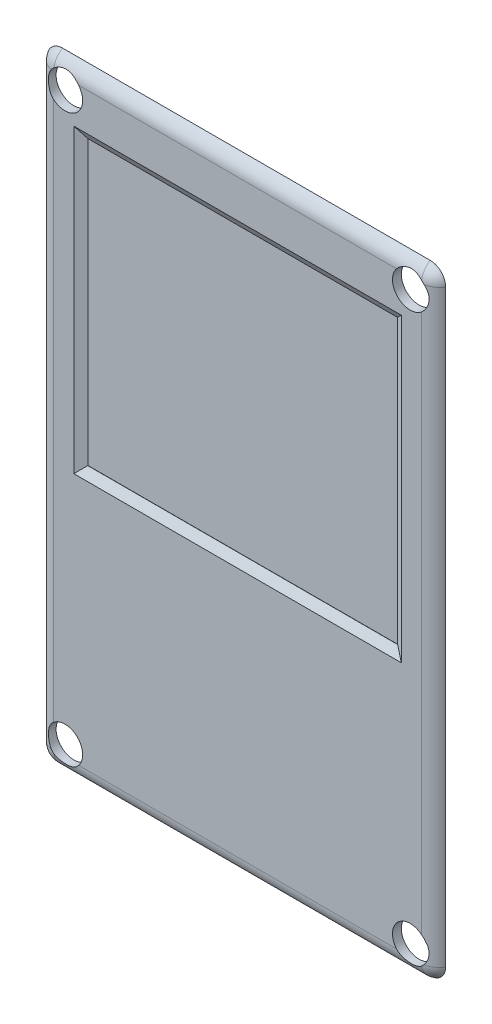
ISO-10303-21;
HEADER;
FILE_DESCRIPTION(('STEP AP214'),'2;1');
FILE_NAME('part.step','',(''),(''),'','','');
FILE_SCHEMA(('AUTOMOTIVE_DESIGN { 1 0 10303 214 1 1 1 1 }'));
ENDSEC;
DATA;
#1=APPLICATION_CONTEXT('core data for automotive mechanical design processes');
#2=APPLICATION_PROTOCOL_DEFINITION('international standard','automotive_design',2000,#1);
#3=PRODUCT_CONTEXT('',#1,'mechanical');
#4=PRODUCT('Part','Part','',(#3));
#5=PRODUCT_RELATED_PRODUCT_CATEGORY('part','',(#4));
#6=PRODUCT_DEFINITION_FORMATION('','',#4);
#7=PRODUCT_DEFINITION_CONTEXT('part definition',#1,'design');
#8=PRODUCT_DEFINITION('design','',#6,#7);
#9=PRODUCT_DEFINITION_SHAPE('','',#8);
#10=(LENGTH_UNIT() NAMED_UNIT(*) SI_UNIT(.MILLI.,.METRE.));
#11=(NAMED_UNIT(*) PLANE_ANGLE_UNIT() SI_UNIT($,.RADIAN.));
#12=(NAMED_UNIT(*) SI_UNIT($,.STERADIAN.) SOLID_ANGLE_UNIT());
#13=UNCERTAINTY_MEASURE_WITH_UNIT(LENGTH_MEASURE(1.E-05),#10,'distance_accuracy_value','');
#14=(GEOMETRIC_REPRESENTATION_CONTEXT(3) GLOBAL_UNCERTAINTY_ASSIGNED_CONTEXT((#13)) GLOBAL_UNIT_ASSIGNED_CONTEXT((#10,
#11,#12)) REPRESENTATION_CONTEXT('',''));
#15=CARTESIAN_POINT('',(0.,0.,0.));
#16=DIRECTION('',(0.,0.,1.));
#17=DIRECTION('',(1.,0.,0.));
#18=AXIS2_PLACEMENT_3D('',#15,#16,#17);
#19=CARTESIAN_POINT('',(0.,0.,1.));
#20=DIRECTION('',(0.,0.,-1.));
#21=DIRECTION('',(-1.,0.,0.));
#22=AXIS2_PLACEMENT_3D('',#19,#20,#21);
#23=PLANE('',#22);
#24=DIRECTION('',(0.,-1.,0.));
#25=VECTOR('',#24,1.);
#26=CARTESIAN_POINT('',(41.,0.,1.));
#27=LINE('',#26,#25);
#28=CARTESIAN_POINT('',(41.,64.,1.));
#29=VERTEX_POINT('',#28);
#30=CARTESIAN_POINT('',(41.,30.,1.));
#31=VERTEX_POINT('',#30);
#32=EDGE_CURVE('E531',#29,#31,#27,.T.);
#33=ORIENTED_EDGE('',*,*,#32,.T.);
#34=DIRECTION('',(-1.,0.,0.));
#35=VECTOR('',#34,1.);
#36=CARTESIAN_POINT('',(0.,30.,1.));
#37=LINE('',#36,#35);
#38=CARTESIAN_POINT('',(3.99999999999999,30.,1.));
#39=VERTEX_POINT('',#38);
#40=EDGE_CURVE('E534',#31,#39,#37,.T.);
#41=ORIENTED_EDGE('',*,*,#40,.T.);
#42=DIRECTION('',(0.,1.,0.));
#43=VECTOR('',#42,1.);
#44=CARTESIAN_POINT('',(3.99999999999999,0.,1.));
#45=LINE('',#44,#43);
#46=CARTESIAN_POINT('',(3.99999999999998,64.,1.));
#47=VERTEX_POINT('',#46);
#48=EDGE_CURVE('E523',#39,#47,#45,.T.);
#49=ORIENTED_EDGE('',*,*,#48,.T.);
#50=DIRECTION('',(1.,0.,0.));
#51=VECTOR('',#50,1.);
#52=CARTESIAN_POINT('',(0.,64.,1.));
#53=LINE('',#52,#51);
#54=EDGE_CURVE('E526',#47,#29,#53,.T.);
#55=ORIENTED_EDGE('',*,*,#54,.T.);
#56=EDGE_LOOP('',(#33,#41,#49,#55));
#57=FACE_BOUND('',#56,.T.);
#58=CARTESIAN_POINT('',(3.,3.,1.));
#59=DIRECTION('',(0.,0.,1.));
#60=DIRECTION('',(1.,0.,0.));
#61=AXIS2_PLACEMENT_3D('',#58,#59,#60);
#62=CIRCLE('',#61,2.);
#63=CARTESIAN_POINT('',(4.54670774402059,1.73205080756888,1.));
#64=VERTEX_POINT('',#63);
#65=CARTESIAN_POINT('',(1.73205080756888,4.54670774402059,1.));
#66=VERTEX_POINT('',#65);
#67=EDGE_CURVE('E233',#64,#66,#62,.T.);
#68=ORIENTED_EDGE('',*,*,#67,.F.);
#69=DIRECTION('',(-1.,0.,0.));
#70=VECTOR('',#69,1.);
#71=CARTESIAN_POINT('',(0.,1.73205080756888,1.));
#72=LINE('',#71,#70);
#73=CARTESIAN_POINT('',(40.4532922559794,1.73205080756888,1.));
#74=VERTEX_POINT('',#73);
#75=EDGE_CURVE('E264',#64,#74,#72,.F.);
#76=ORIENTED_EDGE('',*,*,#75,.T.);
#77=CARTESIAN_POINT('',(42.,3.,1.));
#78=DIRECTION('',(0.,0.,1.));
#79=DIRECTION('',(1.,0.,0.));
#80=AXIS2_PLACEMENT_3D('',#77,#78,#79);
#81=CIRCLE('',#80,2.);
#82=CARTESIAN_POINT('',(43.2679491924311,4.5467077440206,1.));
#83=VERTEX_POINT('',#82);
#84=EDGE_CURVE('E225',#83,#74,#81,.T.);
#85=ORIENTED_EDGE('',*,*,#84,.F.);
#86=DIRECTION('',(0.,-1.,0.));
#87=VECTOR('',#86,1.);
#88=CARTESIAN_POINT('',(43.2679491924311,0.,1.));
#89=LINE('',#88,#87);
#90=CARTESIAN_POINT('',(43.2679491924311,65.4532922559794,1.));
#91=VERTEX_POINT('',#90);
#92=EDGE_CURVE('E255',#83,#91,#89,.F.);
#93=ORIENTED_EDGE('',*,*,#92,.T.);
#94=CARTESIAN_POINT('',(42.,67.,1.));
#95=DIRECTION('',(0.,0.,1.));
#96=DIRECTION('',(1.,0.,0.));
#97=AXIS2_PLACEMENT_3D('',#94,#95,#96);
#98=CIRCLE('',#97,2.);
#99=CARTESIAN_POINT('',(40.4532922559794,68.2679491924311,1.));
#100=VERTEX_POINT('',#99);
#101=EDGE_CURVE('E217',#100,#91,#98,.T.);
#102=ORIENTED_EDGE('',*,*,#101,.F.);
#103=DIRECTION('',(1.,0.,0.));
#104=VECTOR('',#103,1.);
#105=CARTESIAN_POINT('',(0.,68.2679491924311,1.));
#106=LINE('',#105,#104);
#107=CARTESIAN_POINT('',(4.54670774402059,68.2679491924311,1.));
#108=VERTEX_POINT('',#107);
#109=EDGE_CURVE('E258',#100,#108,#106,.F.);
#110=ORIENTED_EDGE('',*,*,#109,.T.);
#111=CARTESIAN_POINT('',(3.,67.,1.));
#112=DIRECTION('',(0.,0.,1.));
#113=DIRECTION('',(1.,0.,0.));
#114=AXIS2_PLACEMENT_3D('',#111,#112,#113);
#115=CIRCLE('',#114,2.);
#116=CARTESIAN_POINT('',(1.73205080756888,65.4532922559794,1.));
#117=VERTEX_POINT('',#116);
#118=EDGE_CURVE('E209',#117,#108,#115,.T.);
#119=ORIENTED_EDGE('',*,*,#118,.F.);
#120=DIRECTION('',(0.,1.,0.));
#121=VECTOR('',#120,1.);
#122=CARTESIAN_POINT('',(1.73205080756888,0.,1.));
#123=LINE('',#122,#121);
#124=EDGE_CURVE('E261',#117,#66,#123,.F.);
#125=ORIENTED_EDGE('',*,*,#124,.T.);
#126=EDGE_LOOP('',(#68,#76,#85,#93,#102,#110,#119,#125));
#127=FACE_BOUND('',#126,.T.);
#128=ADVANCED_FACE('F38',(#57,#127),#23,.F.);
#129=CARTESIAN_POINT('',(0.,0.,0.));
#130=DIRECTION('',(0.,0.,-1.));
#131=DIRECTION('',(-1.,0.,0.));
#132=AXIS2_PLACEMENT_3D('',#129,#130,#131);
#133=PLANE('',#132);
#134=CARTESIAN_POINT('',(42.,67.,0.));
#135=DIRECTION('',(0.,0.,1.));
#136=DIRECTION('',(1.,0.,0.));
#137=AXIS2_PLACEMENT_3D('',#134,#135,#136);
#138=CIRCLE('',#137,2.);
#139=CARTESIAN_POINT('',(44.,67.,0.));
#140=VERTEX_POINT('',#139);
#141=EDGE_CURVE('E213',#140,#140,#138,.T.);
#142=ORIENTED_EDGE('',*,*,#141,.T.);
#143=EDGE_LOOP('',(#142));
#144=FACE_BOUND('',#143,.T.);
#145=CARTESIAN_POINT('',(3.,3.,0.));
#146=DIRECTION('',(0.,0.,1.));
#147=DIRECTION('',(1.,0.,0.));
#148=AXIS2_PLACEMENT_3D('',#145,#146,#147);
#149=CIRCLE('',#148,2.);
#150=CARTESIAN_POINT('',(5.,3.,0.));
#151=VERTEX_POINT('',#150);
#152=EDGE_CURVE('E229',#151,#151,#149,.T.);
#153=ORIENTED_EDGE('',*,*,#152,.T.);
#154=EDGE_LOOP('',(#153));
#155=FACE_BOUND('',#154,.T.);
#156=DIRECTION('',(1.,0.,0.));
#157=VECTOR('',#156,1.);
#158=CARTESIAN_POINT('',(0.,0.,0.));
#159=LINE('',#158,#157);
#160=CARTESIAN_POINT('',(1.73205080756888,0.,0.));
#161=VERTEX_POINT('',#160);
#162=CARTESIAN_POINT('',(43.2679491924311,0.,0.));
#163=VERTEX_POINT('',#162);
#164=EDGE_CURVE('E244',#161,#163,#159,.T.);
#165=ORIENTED_EDGE('',*,*,#164,.F.);
#166=CARTESIAN_POINT('',(1.73205080756888,1.73205080756888,0.));
#167=DIRECTION('',(0.,0.,-1.));
#168=DIRECTION('',(-1.,0.,0.));
#169=AXIS2_PLACEMENT_3D('',#166,#167,#168);
#170=CIRCLE('',#169,1.73205080756888);
#171=CARTESIAN_POINT('',(0.,1.73205080756888,0.));
#172=VERTEX_POINT('',#171);
#173=EDGE_CURVE('E443',#161,#172,#170,.T.);
#174=ORIENTED_EDGE('',*,*,#173,.T.);
#175=DIRECTION('',(0.,-1.,0.));
#176=VECTOR('',#175,1.);
#177=CARTESIAN_POINT('',(0.,0.,0.));
#178=LINE('',#177,#176);
#179=CARTESIAN_POINT('',(0.,68.2679491924311,0.));
#180=VERTEX_POINT('',#179);
#181=EDGE_CURVE('E237',#180,#172,#178,.T.);
#182=ORIENTED_EDGE('',*,*,#181,.F.);
#183=CARTESIAN_POINT('',(1.73205080756888,68.2679491924311,0.));
#184=DIRECTION('',(0.,0.,-1.));
#185=DIRECTION('',(-1.,0.,0.));
#186=AXIS2_PLACEMENT_3D('',#183,#184,#185);
#187=CIRCLE('',#186,1.73205080756888);
#188=CARTESIAN_POINT('',(1.73205080756888,70.,0.));
#189=VERTEX_POINT('',#188);
#190=EDGE_CURVE('E506',#180,#189,#187,.T.);
#191=ORIENTED_EDGE('',*,*,#190,.T.);
#192=DIRECTION('',(-1.,0.,0.));
#193=VECTOR('',#192,1.);
#194=CARTESIAN_POINT('',(0.,70.,0.));
#195=LINE('',#194,#193);
#196=CARTESIAN_POINT('',(43.2679491924311,70.,0.));
#197=VERTEX_POINT('',#196);
#198=EDGE_CURVE('E252',#197,#189,#195,.T.);
#199=ORIENTED_EDGE('',*,*,#198,.F.);
#200=CARTESIAN_POINT('',(43.2679491924311,68.2679491924311,0.));
#201=DIRECTION('',(0.,0.,-1.));
#202=DIRECTION('',(-1.,0.,0.));
#203=AXIS2_PLACEMENT_3D('',#200,#201,#202);
#204=CIRCLE('',#203,1.73205080756888);
#205=CARTESIAN_POINT('',(45.,68.2679491924311,0.));
#206=VERTEX_POINT('',#205);
#207=EDGE_CURVE('E437',#197,#206,#204,.T.);
#208=ORIENTED_EDGE('',*,*,#207,.T.);
#209=DIRECTION('',(0.,1.,0.));
#210=VECTOR('',#209,1.);
#211=CARTESIAN_POINT('',(45.,0.,0.));
#212=LINE('',#211,#210);
#213=CARTESIAN_POINT('',(45.,1.73205080756888,0.));
#214=VERTEX_POINT('',#213);
#215=EDGE_CURVE('E248',#214,#206,#212,.T.);
#216=ORIENTED_EDGE('',*,*,#215,.F.);
#217=CARTESIAN_POINT('',(43.2679491924311,1.73205080756888,0.));
#218=DIRECTION('',(0.,0.,-1.));
#219=DIRECTION('',(-1.,0.,0.));
#220=AXIS2_PLACEMENT_3D('',#217,#218,#219);
#221=CIRCLE('',#220,1.73205080756888);
#222=EDGE_CURVE('E440',#214,#163,#221,.T.);
#223=ORIENTED_EDGE('',*,*,#222,.T.);
#224=EDGE_LOOP('',(#165,#174,#182,#191,#199,#208,#216,#223));
#225=FACE_BOUND('',#224,.T.);
#226=CARTESIAN_POINT('',(42.,3.,0.));
#227=DIRECTION('',(0.,0.,1.));
#228=DIRECTION('',(1.,0.,0.));
#229=AXIS2_PLACEMENT_3D('',#226,#227,#228);
#230=CIRCLE('',#229,2.);
#231=CARTESIAN_POINT('',(44.,3.,0.));
#232=VERTEX_POINT('',#231);
#233=EDGE_CURVE('E221',#232,#232,#230,.T.);
#234=ORIENTED_EDGE('',*,*,#233,.T.);
#235=EDGE_LOOP('',(#234));
#236=FACE_BOUND('',#235,.T.);
#237=CARTESIAN_POINT('',(3.,67.,0.));
#238=DIRECTION('',(0.,0.,1.));
#239=DIRECTION('',(1.,0.,0.));
#240=AXIS2_PLACEMENT_3D('',#237,#238,#239);
#241=CIRCLE('',#240,2.);
#242=CARTESIAN_POINT('',(5.,67.,0.));
#243=VERTEX_POINT('',#242);
#244=EDGE_CURVE('E203',#243,#243,#241,.T.);
#245=ORIENTED_EDGE('',*,*,#244,.T.);
#246=EDGE_LOOP('',(#245));
#247=FACE_BOUND('',#246,.T.);
#248=ADVANCED_FACE('F370',(#144,#155,#225,#236,#247),#133,.T.);
#249=CARTESIAN_POINT('',(3.,3.,1.));
#250=DIRECTION('',(0.,0.,-1.));
#251=DIRECTION('',(-1.,0.,0.));
#252=AXIS2_PLACEMENT_3D('',#249,#250,#251);
#253=CYLINDRICAL_SURFACE('',#252,2.);
#254=CARTESIAN_POINT('',(1.73205080756888,4.54670774402059,1.));
#255=CARTESIAN_POINT('',(1.68942090742648,4.51176501398997,0.99999994952929));
#256=CARTESIAN_POINT('',(1.64827955739233,4.47508684268151,0.998637351965732));
#257=CARTESIAN_POINT('',(1.56925683016252,4.39856871271128,0.993756114654367));
#258=CARTESIAN_POINT('',(1.53137248495384,4.35873169765017,0.990239462099776));
#259=CARTESIAN_POINT('',(1.42309253267321,4.23504683389057,0.977327109578218));
#260=CARTESIAN_POINT('',(1.35785797276758,4.14685056381454,0.965563417623844));
#261=CARTESIAN_POINT('',(1.24291285980056,3.96152346106263,0.940158015800067));
#262=CARTESIAN_POINT('',(1.19316416453257,3.86441535560524,0.926521041357541));
#263=CARTESIAN_POINT('',(1.10999943956261,3.66313191366588,0.901301177702394));
#264=CARTESIAN_POINT('',(1.07658554196436,3.55895565663139,0.889718556760454));
#265=CARTESIAN_POINT('',(1.02633374124687,3.34258403755406,0.871555789387361));
#266=CARTESIAN_POINT('',(1.01007205655011,3.23023794549001,0.86515113449693));
#267=CARTESIAN_POINT('',(0.996809596749699,3.00429539104492,0.85996765158949));
#268=CARTESIAN_POINT('',(0.999795040508532,2.89069988142584,0.861183367293215));
#269=CARTESIAN_POINT('',(1.02400942586525,2.67349712188182,0.87051166867929));
#270=CARTESIAN_POINT('',(1.04400915503521,2.56972877686385,0.878159169435495));
#271=CARTESIAN_POINT('',(1.09991864939778,2.36692401757929,0.897703790653173));
#272=CARTESIAN_POINT('',(1.13584745671772,2.2678934244253,0.909605994013024));
#273=CARTESIAN_POINT('',(1.22870909902796,2.06364863875985,0.936305671339136));
#274=CARTESIAN_POINT('',(1.28784302529463,1.9594420378841,0.951276473734035));
#275=CARTESIAN_POINT('',(1.38986004665449,1.81213185110468,0.970812431575449));
#276=CARTESIAN_POINT('',(1.42610285787408,1.76451054210445,0.976839601412846));
#277=CARTESIAN_POINT('',(1.50282428887054,1.67257870500859,0.987197266390099));
#278=CARTESIAN_POINT('',(1.54330494581549,1.62826978691197,0.991526940740406));
#279=CARTESIAN_POINT('',(1.5857864376269,1.5857864376269,0.994644513211687));
#280=B_SPLINE_CURVE_WITH_KNOTS('',3,(#254,#255,#256,#257,#258,#259,#260,#261,#262,#263,#264,
#265,#266,#267,#268,#269,#270,#271,#272,#273,#274,#275,#276,#277,#278,#279),.UNSPECIFIED.,.F.,
.F.,(4,2,2,2,2,2,2,2,2,2,2,2,4),(0.,0.165212127740173,0.330272070422933,0.659579373309191,
0.988069043263213,1.31660157797707,1.65585005475403,1.99485565320083,2.31126614131278,
2.62805590079043,2.98818591899734,3.16840034679873,3.34870180648225),.UNSPECIFIED.);
#281=CARTESIAN_POINT('',(1.45329225597941,1.73205080756888,0.980478141741469));
#282=VERTEX_POINT('',#281);
#283=EDGE_CURVE('E386',#66,#282,#280,.T.);
#284=ORIENTED_EDGE('',*,*,#283,.T.);
#285=CARTESIAN_POINT('',(1.45329225597941,1.73205080756888,0.980478141741469));
#286=CARTESIAN_POINT('',(1.49516195181283,1.68100098620581,0.986342452939327));
#287=CARTESIAN_POINT('',(1.53932667902866,1.63224619622515,0.989274608538257));
#288=CARTESIAN_POINT('',(1.63224619622515,1.53932667902866,0.989274608538257));
#289=CARTESIAN_POINT('',(1.68100098620581,1.49516195181283,0.986342452939328));
#290=CARTESIAN_POINT('',(1.73205080756888,1.45329225597941,0.980478141741469));
#291=B_SPLINE_CURVE_WITH_KNOTS('',3,(#285,#286,#287,#288,#289,#290),.UNSPECIFIED.,.F.,.F.,(4,2,
4),(0.,0.197548353354486,0.395096706708971),.UNSPECIFIED.);
#292=CARTESIAN_POINT('',(1.73205080756888,1.45329225597941,0.980478141741469));
#293=VERTEX_POINT('',#292);
#294=EDGE_CURVE('E448',#282,#293,#291,.T.);
#295=ORIENTED_EDGE('',*,*,#294,.T.);
#296=CARTESIAN_POINT('',(1.5857864376269,1.5857864376269,0.994644513211685));
#297=CARTESIAN_POINT('',(1.62547790093061,1.54609521000282,0.991732114062964));
#298=CARTESIAN_POINT('',(1.66676888227213,1.5081469392458,0.987760648980565));
#299=CARTESIAN_POINT('',(1.7522623619633,1.43594071238718,0.978293495590112));
#300=CARTESIAN_POINT('',(1.79646325547829,1.40168074918575,0.972798642158532));
#301=CARTESIAN_POINT('',(1.9331026581126,1.30465253951394,0.954907343353973));
#302=CARTESIAN_POINT('',(2.02954723121612,1.24766650896851,0.941107280589293));
#303=CARTESIAN_POINT('',(2.23054449822809,1.15056736922675,0.914268959196729));
#304=CARTESIAN_POINT('',(2.33509156877025,1.11044267980462,0.901230183040374));
#305=CARTESIAN_POINT('',(2.5497763489647,1.04814084773677,0.879725051697459));
#306=CARTESIAN_POINT('',(2.65990663248714,1.02594049705345,0.871252788633561));
#307=CARTESIAN_POINT('',(2.88114449692771,1.00047567891466,0.861448691684427));
#308=CARTESIAN_POINT('',(2.99221810171246,0.996956338547368,0.860020768031279));
#309=CARTESIAN_POINT('',(3.21329671443733,1.00832669230901,0.864472262637201));
#310=CARTESIAN_POINT('',(3.32330134213203,1.02322271158814,0.870354191625569));
#311=CARTESIAN_POINT('',(3.53371767710658,1.06966260178721,0.887273960773298));
#312=CARTESIAN_POINT('',(3.63433658802757,1.10037676865242,0.898051940207506));
#313=CARTESIAN_POINT('',(3.82927857343943,1.17701249896315,0.921858243254639));
#314=CARTESIAN_POINT('',(3.92360085153713,1.22293598170876,0.934886850780407));
#315=CARTESIAN_POINT('',(4.11463818683418,1.33530231731338,0.961194415055279));
#316=CARTESIAN_POINT('',(4.21035368078922,1.40351146666493,0.974325972163911));
#317=CARTESIAN_POINT('',(4.34420653824554,1.51791435091081,0.988876128459159));
#318=CARTESIAN_POINT('',(4.38726662198028,1.55813937245688,0.992870617265208));
#319=CARTESIAN_POINT('',(4.46978599965384,1.64235168439409,0.99843361559077));
#320=CARTESIAN_POINT('',(4.50924173652149,1.68634261012405,0.999999752438308));
#321=CARTESIAN_POINT('',(4.54670774402059,1.73205080756888,1.));
#322=B_SPLINE_CURVE_WITH_KNOTS('',3,(#296,#297,#298,#299,#300,#301,#302,#303,#304,#305,#306,
#307,#308,#309,#310,#311,#312,#313,#314,#315,#316,#317,#318,#319,#320,#321),.UNSPECIFIED.,.F.,
.F.,(4,2,2,2,2,2,2,2,2,2,2,2,4),(0.,0.168482724473795,0.336873295723139,0.673782866276044,
1.01046067052941,1.34670184956735,1.67834353076247,2.01009915305919,2.32599866069285,
2.64193804764297,2.99465461936718,3.17159360464045,3.34870536314445),.UNSPECIFIED.);
#323=EDGE_CURVE('E393',#293,#64,#322,.T.);
#324=ORIENTED_EDGE('',*,*,#323,.T.);
#325=ORIENTED_EDGE('',*,*,#67,.T.);
#326=EDGE_LOOP('',(#284,#295,#324,#325));
#327=FACE_BOUND('',#326,.T.);
#328=ORIENTED_EDGE('',*,*,#152,.F.);
#329=EDGE_LOOP('',(#328));
#330=FACE_BOUND('',#329,.T.);
#331=ADVANCED_FACE('F378',(#327,#330),#253,.F.);
#332=CARTESIAN_POINT('',(42.,3.,1.));
#333=DIRECTION('',(0.,0.,-1.));
#334=DIRECTION('',(-1.,0.,0.));
#335=AXIS2_PLACEMENT_3D('',#332,#333,#334);
#336=CYLINDRICAL_SURFACE('',#335,2.);
#337=CARTESIAN_POINT('',(40.4532922559794,1.73205080756888,1.));
#338=CARTESIAN_POINT('',(40.48823498601,1.68942090742648,0.999999949529289));
#339=CARTESIAN_POINT('',(40.5249131573185,1.64827955739233,0.998637351965732));
#340=CARTESIAN_POINT('',(40.6014312872887,1.56925683016252,0.993756114654367));
#341=CARTESIAN_POINT('',(40.6412683023498,1.53137248495384,0.990239462099776));
#342=CARTESIAN_POINT('',(40.7649531661094,1.42309253267321,0.977327109578219));
#343=CARTESIAN_POINT('',(40.8531494361855,1.35785797276758,0.965563417623844));
#344=CARTESIAN_POINT('',(41.0384765389374,1.24291285980056,0.940158015800066));
#345=CARTESIAN_POINT('',(41.1355846443948,1.19316416453257,0.926521041357541));
#346=CARTESIAN_POINT('',(41.3368680863341,1.1099994395626,0.901301177702394));
#347=CARTESIAN_POINT('',(41.4410443433686,1.07658554196436,0.889718556760453));
#348=CARTESIAN_POINT('',(41.6574159624459,1.02633374124687,0.87155578938736));
#349=CARTESIAN_POINT('',(41.76976205451,1.0100720565501,0.865151134496928));
#350=CARTESIAN_POINT('',(41.9957046089551,0.996809596749696,0.859967651589488));
#351=CARTESIAN_POINT('',(42.1093001185742,0.999795040508528,0.861183367293213));
#352=CARTESIAN_POINT('',(42.3265028781182,1.02400942586525,0.870511668679288));
#353=CARTESIAN_POINT('',(42.4302712231361,1.04400915503521,0.878159169435493));
#354=CARTESIAN_POINT('',(42.6330759824207,1.09991864939778,0.897703790653171));
#355=CARTESIAN_POINT('',(42.7321065755747,1.13584745671771,0.909605994013023));
#356=CARTESIAN_POINT('',(42.9363513612401,1.22870909902795,0.936305671339134));
#357=CARTESIAN_POINT('',(43.0405579621159,1.28784302529463,0.951276473734033));
#358=CARTESIAN_POINT('',(43.1878681488953,1.38986004665448,0.970812431575447));
#359=CARTESIAN_POINT('',(43.2354894578955,1.42610285787407,0.976839601412845));
#360=CARTESIAN_POINT('',(43.3274212949914,1.50282428887053,0.987197266390098));
#361=CARTESIAN_POINT('',(43.371730213088,1.54330494581548,0.991526940740405));
#362=CARTESIAN_POINT('',(43.4142135623731,1.5857864376269,0.994644513211686));
#363=B_SPLINE_CURVE_WITH_KNOTS('',3,(#337,#338,#339,#340,#341,#342,#343,#344,#345,#346,#347,
#348,#349,#350,#351,#352,#353,#354,#355,#356,#357,#358,#359,#360,#361,#362),.UNSPECIFIED.,.F.,
.F.,(4,2,2,2,2,2,2,2,2,2,2,2,4),(0.,0.165212127740179,0.330272070422937,0.659579373309193,
0.988069043263215,1.31660157797707,1.65585005475403,1.99485565320083,2.31126614131278,
2.62805590079043,2.98818591899734,3.16840034679872,3.34870180648225),.UNSPECIFIED.);
#364=CARTESIAN_POINT('',(43.2679491924311,1.4532922559794,0.980478141741468));
#365=VERTEX_POINT('',#364);
#366=EDGE_CURVE('E277',#74,#365,#363,.T.);
#367=ORIENTED_EDGE('',*,*,#366,.T.);
#368=CARTESIAN_POINT('',(43.2679491924311,1.4532922559794,0.980478141741468));
#369=CARTESIAN_POINT('',(43.3189990137942,1.49516195181282,0.986342452939327));
#370=CARTESIAN_POINT('',(43.3677538037748,1.53932667902865,0.989274608538256));
#371=CARTESIAN_POINT('',(43.4606733209713,1.63224619622514,0.989274608538257));
#372=CARTESIAN_POINT('',(43.5048380481872,1.6810009862058,0.986342452939327));
#373=CARTESIAN_POINT('',(43.5467077440206,1.73205080756888,0.980478141741468));
#374=B_SPLINE_CURVE_WITH_KNOTS('',3,(#368,#369,#370,#371,#372,#373),.UNSPECIFIED.,.F.,.F.,(4,2,
4),(0.,0.197548353354486,0.395096706708985),.UNSPECIFIED.);
#375=CARTESIAN_POINT('',(43.5467077440206,1.73205080756888,0.980478141741467));
#376=VERTEX_POINT('',#375);
#377=EDGE_CURVE('E455',#365,#376,#374,.T.);
#378=ORIENTED_EDGE('',*,*,#377,.T.);
#379=CARTESIAN_POINT('',(43.4142135623731,1.5857864376269,0.994644513211685));
#380=CARTESIAN_POINT('',(43.4539047899972,1.62547790093061,0.991732114062964));
#381=CARTESIAN_POINT('',(43.4918530607542,1.66676888227213,0.987760648980566));
#382=CARTESIAN_POINT('',(43.5640592876128,1.75226236196329,0.978293495590112));
#383=CARTESIAN_POINT('',(43.5983192508142,1.79646325547828,0.972798642158531));
#384=CARTESIAN_POINT('',(43.6953474604861,1.9331026581126,0.954907343353971));
#385=CARTESIAN_POINT('',(43.7523334910315,2.02954723121611,0.941107280589291));
#386=CARTESIAN_POINT('',(43.8494326307732,2.23054449822808,0.914268959196726));
#387=CARTESIAN_POINT('',(43.8895573201954,2.33509156877025,0.901230183040371));
#388=CARTESIAN_POINT('',(43.9518591522632,2.5497763489647,0.879725051697457));
#389=CARTESIAN_POINT('',(43.9740595029466,2.65990663248713,0.871252788633558));
#390=CARTESIAN_POINT('',(43.9995243210853,2.8811444969277,0.861448691684425));
#391=CARTESIAN_POINT('',(44.0030436614526,2.99221810171246,0.860020768031276));
#392=CARTESIAN_POINT('',(43.991673307691,3.21329671443733,0.864472262637197));
#393=CARTESIAN_POINT('',(43.9767772884119,3.32330134213202,0.870354191625566));
#394=CARTESIAN_POINT('',(43.9303373982128,3.53371767710657,0.887273960773295));
#395=CARTESIAN_POINT('',(43.8996232313476,3.63433658802757,0.898051940207503));
#396=CARTESIAN_POINT('',(43.8229875010369,3.82927857343942,0.921858243254635));
#397=CARTESIAN_POINT('',(43.7770640182912,3.92360085153713,0.934886850780403));
#398=CARTESIAN_POINT('',(43.6646976826866,4.11463818683418,0.961194415055277));
#399=CARTESIAN_POINT('',(43.5964885333351,4.21035368078922,0.97432597216391));
#400=CARTESIAN_POINT('',(43.4820856490892,4.34420653824555,0.988876128459159));
#401=CARTESIAN_POINT('',(43.4418606275431,4.38726662198029,0.992870617265208));
#402=CARTESIAN_POINT('',(43.3576483156059,4.46978599965384,0.99843361559077));
#403=CARTESIAN_POINT('',(43.3136573898759,4.50924173652149,0.999999752438309));
#404=CARTESIAN_POINT('',(43.2679491924311,4.5467077440206,1.));
#405=B_SPLINE_CURVE_WITH_KNOTS('',3,(#379,#380,#381,#382,#383,#384,#385,#386,#387,#388,#389,
#390,#391,#392,#393,#394,#395,#396,#397,#398,#399,#400,#401,#402,#403,#404),.UNSPECIFIED.,.F.,
.F.,(4,2,2,2,2,2,2,2,2,2,2,2,4),(0.,0.168482724473791,0.336873295723138,0.673782866276042,
1.0104606705294,1.34670184956735,1.67834353076246,2.01009915305919,2.32599866069285,
2.64193804764297,2.99465461936719,3.17159360464046,3.34870536314447),.UNSPECIFIED.);
#406=EDGE_CURVE('E268',#376,#83,#405,.T.);
#407=ORIENTED_EDGE('',*,*,#406,.T.);
#408=ORIENTED_EDGE('',*,*,#84,.T.);
#409=EDGE_LOOP('',(#367,#378,#407,#408));
#410=FACE_BOUND('',#409,.T.);
#411=ORIENTED_EDGE('',*,*,#233,.F.);
#412=EDGE_LOOP('',(#411));
#413=FACE_BOUND('',#412,.T.);
#414=ADVANCED_FACE('F284',(#410,#413),#336,.F.);
#415=CARTESIAN_POINT('',(42.,67.,1.));
#416=DIRECTION('',(0.,0.,-1.));
#417=DIRECTION('',(-1.,0.,0.));
#418=AXIS2_PLACEMENT_3D('',#415,#416,#417);
#419=CYLINDRICAL_SURFACE('',#418,2.);
#420=CARTESIAN_POINT('',(43.2679491924311,65.4532922559794,1.));
#421=CARTESIAN_POINT('',(43.3105790925735,65.48823498601,0.99999994952929));
#422=CARTESIAN_POINT('',(43.3517204426077,65.5249131573185,0.998637351965732));
#423=CARTESIAN_POINT('',(43.4307431698375,65.6014312872887,0.993756114654367));
#424=CARTESIAN_POINT('',(43.4686275150462,65.6412683023498,0.990239462099776));
#425=CARTESIAN_POINT('',(43.5769074673268,65.7649531661094,0.977327109578218));
#426=CARTESIAN_POINT('',(43.6421420272324,65.8531494361855,0.965563417623843));
#427=CARTESIAN_POINT('',(43.7570871401994,66.0384765389374,0.940158015800065));
#428=CARTESIAN_POINT('',(43.8068358354674,66.1355846443948,0.926521041357538));
#429=CARTESIAN_POINT('',(43.8900005604374,66.3368680863341,0.90130117770239));
#430=CARTESIAN_POINT('',(43.9234144580356,66.4410443433686,0.88971855676045));
#431=CARTESIAN_POINT('',(43.9736662587531,66.6574159624459,0.871555789387357));
#432=CARTESIAN_POINT('',(43.9899279434499,66.76976205451,0.865151134496926));
#433=CARTESIAN_POINT('',(44.0031904032503,66.9957046089551,0.859967651589487));
#434=CARTESIAN_POINT('',(44.0002049594915,67.1093001185742,0.861183367293211));
#435=CARTESIAN_POINT('',(43.9759905741348,67.3265028781182,0.870511668679287));
#436=CARTESIAN_POINT('',(43.9559908449648,67.4302712231361,0.878159169435492));
#437=CARTESIAN_POINT('',(43.9000813506022,67.6330759824207,0.89770379065317));
#438=CARTESIAN_POINT('',(43.8641525432823,67.7321065755747,0.909605994013022));
#439=CARTESIAN_POINT('',(43.7712909009721,67.9363513612402,0.936305671339133));
#440=CARTESIAN_POINT('',(43.7121569747054,68.0405579621159,0.951276473734032));
#441=CARTESIAN_POINT('',(43.6101399533455,68.1878681488953,0.970812431575447));
#442=CARTESIAN_POINT('',(43.5738971421259,68.2354894578956,0.976839601412845));
#443=CARTESIAN_POINT('',(43.4971757111295,68.3274212949914,0.987197266390098));
#444=CARTESIAN_POINT('',(43.4566950541845,68.371730213088,0.991526940740405));
#445=CARTESIAN_POINT('',(43.4142135623731,68.4142135623731,0.994644513211685));
#446=B_SPLINE_CURVE_WITH_KNOTS('',3,(#420,#421,#422,#423,#424,#425,#426,#427,#428,#429,#430,
#431,#432,#433,#434,#435,#436,#437,#438,#439,#440,#441,#442,#443,#444,#445),.UNSPECIFIED.,.F.,
.F.,(4,2,2,2,2,2,2,2,2,2,2,2,4),(0.,0.165212127740168,0.330272070422939,0.659579373309203,
0.988069043263237,1.31660157797709,1.65585005475406,1.99485565320086,2.31126614131279,
2.62805590079045,2.98818591899735,3.16840034679875,3.34870180648228),.UNSPECIFIED.);
#447=CARTESIAN_POINT('',(43.5467077440206,68.2679491924311,0.980478141741469));
#448=VERTEX_POINT('',#447);
#449=EDGE_CURVE('E301',#91,#448,#446,.T.);
#450=ORIENTED_EDGE('',*,*,#449,.T.);
#451=CARTESIAN_POINT('',(43.5467077440206,68.2679491924311,0.980478141741468));
#452=CARTESIAN_POINT('',(43.5048380481872,68.3189990137942,0.986342452939327));
#453=CARTESIAN_POINT('',(43.4606733209713,68.3677538037749,0.989274608538257));
#454=CARTESIAN_POINT('',(43.3677538037749,68.4606733209714,0.989274608538257));
#455=CARTESIAN_POINT('',(43.3189990137942,68.5048380481872,0.986342452939328));
#456=CARTESIAN_POINT('',(43.2679491924311,68.5467077440206,0.980478141741469));
#457=B_SPLINE_CURVE_WITH_KNOTS('',3,(#451,#452,#453,#454,#455,#456),.UNSPECIFIED.,.F.,.F.,(4,2,
4),(0.,0.197548353354484,0.395096706708983),.UNSPECIFIED.);
#458=CARTESIAN_POINT('',(43.2679491924311,68.5467077440206,0.980478141741469));
#459=VERTEX_POINT('',#458);
#460=EDGE_CURVE('E333',#448,#459,#457,.T.);
#461=ORIENTED_EDGE('',*,*,#460,.T.);
#462=CARTESIAN_POINT('',(43.4142135623731,68.4142135623731,0.994644513211685));
#463=CARTESIAN_POINT('',(43.3745220990694,68.4539047899972,0.991732114062964));
#464=CARTESIAN_POINT('',(43.3332311177279,68.4918530607542,0.987760648980566));
#465=CARTESIAN_POINT('',(43.2477376380367,68.5640592876128,0.978293495590112));
#466=CARTESIAN_POINT('',(43.2035367445217,68.5983192508143,0.972798642158531));
#467=CARTESIAN_POINT('',(43.0668973418874,68.6953474604861,0.954907343353971));
#468=CARTESIAN_POINT('',(42.9704527687839,68.7523334910315,0.941107280589292));
#469=CARTESIAN_POINT('',(42.7694555017719,68.8494326307733,0.914268959196728));
#470=CARTESIAN_POINT('',(42.6649084312297,68.8895573201954,0.901230183040373));
#471=CARTESIAN_POINT('',(42.4502236510353,68.9518591522633,0.879725051697458));
#472=CARTESIAN_POINT('',(42.3400933675128,68.9740595029466,0.871252788633561));
#473=CARTESIAN_POINT('',(42.1188555030723,68.9995243210853,0.861448691684429));
#474=CARTESIAN_POINT('',(42.0077818982875,69.0030436614526,0.860020768031281));
#475=CARTESIAN_POINT('',(41.7867032855626,68.991673307691,0.864472262637204));
#476=CARTESIAN_POINT('',(41.6766986578679,68.9767772884119,0.870354191625573));
#477=CARTESIAN_POINT('',(41.4662823228934,68.9303373982128,0.887273960773303));
#478=CARTESIAN_POINT('',(41.3656634119724,68.8996232313476,0.898051940207512));
#479=CARTESIAN_POINT('',(41.1707214265605,68.8229875010368,0.921858243254644));
#480=CARTESIAN_POINT('',(41.0763991484628,68.7770640182912,0.934886850780411));
#481=CARTESIAN_POINT('',(40.8853618131658,68.6646976826866,0.961194415055283));
#482=CARTESIAN_POINT('',(40.7896463192108,68.5964885333351,0.974325972163914));
#483=CARTESIAN_POINT('',(40.6557934617544,68.4820856490892,0.98887612845916));
#484=CARTESIAN_POINT('',(40.6127333780197,68.4418606275431,0.992870617265209));
#485=CARTESIAN_POINT('',(40.5302140003462,68.3576483156059,0.99843361559077));
#486=CARTESIAN_POINT('',(40.4907582634785,68.313657389876,0.999999752438308));
#487=CARTESIAN_POINT('',(40.4532922559794,68.2679491924311,1.));
#488=B_SPLINE_CURVE_WITH_KNOTS('',3,(#462,#463,#464,#465,#466,#467,#468,#469,#470,#471,#472,
#473,#474,#475,#476,#477,#478,#479,#480,#481,#482,#483,#484,#485,#486,#487),.UNSPECIFIED.,.F.,
.F.,(4,2,2,2,2,2,2,2,2,2,2,2,4),(0.,0.168482724473799,0.336873295723139,0.673782866276056,
1.01046067052943,1.34670184956737,1.67834353076249,2.01009915305923,2.32599866069288,
2.64193804764299,2.99465461936719,3.17159360464044,3.34870536314444),.UNSPECIFIED.);
#489=EDGE_CURVE('E310',#459,#100,#488,.T.);
#490=ORIENTED_EDGE('',*,*,#489,.T.);
#491=ORIENTED_EDGE('',*,*,#101,.T.);
#492=EDGE_LOOP('',(#450,#461,#490,#491));
#493=FACE_BOUND('',#492,.T.);
#494=ORIENTED_EDGE('',*,*,#141,.F.);
#495=EDGE_LOOP('',(#494));
#496=FACE_BOUND('',#495,.T.);
#497=ADVANCED_FACE('F323',(#493,#496),#419,.F.);
#498=CARTESIAN_POINT('',(3.,67.,1.));
#499=DIRECTION('',(0.,0.,-1.));
#500=DIRECTION('',(-1.,0.,0.));
#501=AXIS2_PLACEMENT_3D('',#498,#499,#500);
#502=CYLINDRICAL_SURFACE('',#501,2.);
#503=CARTESIAN_POINT('',(4.54670774402059,68.2679491924311,1.));
#504=CARTESIAN_POINT('',(4.51176501398997,68.3105790925735,0.99999994952929));
#505=CARTESIAN_POINT('',(4.4750868426815,68.3517204426077,0.998637351965732));
#506=CARTESIAN_POINT('',(4.39856871271128,68.4307431698375,0.993756114654368));
#507=CARTESIAN_POINT('',(4.35873169765017,68.4686275150462,0.990239462099777));
#508=CARTESIAN_POINT('',(4.23504683389057,68.5769074673268,0.97732710957822));
#509=CARTESIAN_POINT('',(4.14685056381454,68.6421420272324,0.965563417623846));
#510=CARTESIAN_POINT('',(3.96152346106263,68.7570871401994,0.940158015800068));
#511=CARTESIAN_POINT('',(3.86441535560524,68.8068358354674,0.926521041357543));
#512=CARTESIAN_POINT('',(3.66313191366587,68.8900005604374,0.901301177702396));
#513=CARTESIAN_POINT('',(3.55895565663138,68.9234144580357,0.889718556760456));
#514=CARTESIAN_POINT('',(3.34258403755405,68.9736662587531,0.871555789387363));
#515=CARTESIAN_POINT('',(3.23023794549,68.9899279434499,0.865151134496932));
#516=CARTESIAN_POINT('',(3.00429539104491,69.0031904032503,0.859967651589493));
#517=CARTESIAN_POINT('',(2.89069988142584,69.0002049594915,0.861183367293218));
#518=CARTESIAN_POINT('',(2.67349712188181,68.9759905741348,0.870511668679293));
#519=CARTESIAN_POINT('',(2.56972877686384,68.9559908449648,0.878159169435498));
#520=CARTESIAN_POINT('',(2.36692401757928,68.9000813506022,0.897703790653176));
#521=CARTESIAN_POINT('',(2.26789342442529,68.8641525432823,0.909605994013028));
#522=CARTESIAN_POINT('',(2.06364863875985,68.771290900972,0.936305671339138));
#523=CARTESIAN_POINT('',(1.95944203788411,68.7121569747054,0.951276473734035));
#524=CARTESIAN_POINT('',(1.81213185110469,68.6101399533455,0.970812431575449));
#525=CARTESIAN_POINT('',(1.76451054210446,68.5738971421259,0.976839601412847));
#526=CARTESIAN_POINT('',(1.6725787050086,68.4971757111295,0.9871972663901));
#527=CARTESIAN_POINT('',(1.62826978691198,68.4566950541845,0.991526940740406));
#528=CARTESIAN_POINT('',(1.58578643762691,68.4142135623731,0.994644513211687));
#529=B_SPLINE_CURVE_WITH_KNOTS('',3,(#503,#504,#505,#506,#507,#508,#509,#510,#511,#512,#513,
#514,#515,#516,#517,#518,#519,#520,#521,#522,#523,#524,#525,#526,#527,#528),.UNSPECIFIED.,.F.,
.F.,(4,2,2,2,2,2,2,2,2,2,2,2,4),(0.,0.165212127740173,0.330272070422928,0.659579373309185,
0.988069043263209,1.31660157797707,1.65585005475403,1.99485565320083,2.31126614131278,
2.62805590079043,2.98818591899732,3.16840034679871,3.34870180648224),.UNSPECIFIED.);
#530=CARTESIAN_POINT('',(1.73205080756888,68.5467077440206,0.980478141741469));
#531=VERTEX_POINT('',#530);
#532=EDGE_CURVE('E399',#108,#531,#529,.T.);
#533=ORIENTED_EDGE('',*,*,#532,.T.);
#534=CARTESIAN_POINT('',(1.73205080756888,68.5467077440206,0.98047814174147));
#535=CARTESIAN_POINT('',(1.68100098620581,68.5048380481872,0.986342452939329));
#536=CARTESIAN_POINT('',(1.63224619622515,68.4606733209714,0.989274608538258));
#537=CARTESIAN_POINT('',(1.53932667902866,68.3677538037749,0.989274608538258));
#538=CARTESIAN_POINT('',(1.49516195181283,68.3189990137942,0.986342452939329));
#539=CARTESIAN_POINT('',(1.45329225597941,68.2679491924311,0.98047814174147));
#540=B_SPLINE_CURVE_WITH_KNOTS('',3,(#534,#535,#536,#537,#538,#539),.UNSPECIFIED.,.F.,.F.,(4,2,
4),(0.,0.197548353354475,0.395096706708962),.UNSPECIFIED.);
#541=CARTESIAN_POINT('',(1.45329225597942,68.2679491924311,0.98047814174147));
#542=VERTEX_POINT('',#541);
#543=EDGE_CURVE('E419',#531,#542,#540,.T.);
#544=ORIENTED_EDGE('',*,*,#543,.T.);
#545=CARTESIAN_POINT('',(1.58578643762691,68.4142135623731,0.994644513211686));
#546=CARTESIAN_POINT('',(1.54609521000282,68.3745220990694,0.991732114062965));
#547=CARTESIAN_POINT('',(1.5081469392458,68.3332311177279,0.987760648980566));
#548=CARTESIAN_POINT('',(1.43594071238718,68.2477376380367,0.978293495590113));
#549=CARTESIAN_POINT('',(1.40168074918575,68.2035367445217,0.972798642158532));
#550=CARTESIAN_POINT('',(1.30465253951393,68.0668973418874,0.954907343353972));
#551=CARTESIAN_POINT('',(1.24766650896851,67.9704527687839,0.941107280589292));
#552=CARTESIAN_POINT('',(1.15056736922675,67.7694555017719,0.914268959196726));
#553=CARTESIAN_POINT('',(1.11044267980461,67.6649084312297,0.90123018304037));
#554=CARTESIAN_POINT('',(1.04814084773676,67.4502236510353,0.879725051697457));
#555=CARTESIAN_POINT('',(1.02594049705345,67.3400933675128,0.87125278863356));
#556=CARTESIAN_POINT('',(1.00047567891466,67.1188555030723,0.861448691684427));
#557=CARTESIAN_POINT('',(0.996956338547368,67.0077818982875,0.860020768031278));
#558=CARTESIAN_POINT('',(1.00832669230902,66.7867032855627,0.864472262637201));
#559=CARTESIAN_POINT('',(1.02322271158814,66.676698657868,0.87035419162557));
#560=CARTESIAN_POINT('',(1.06966260178722,66.4662823228934,0.8872739607733));
#561=CARTESIAN_POINT('',(1.10037676865242,66.3656634119724,0.898051940207508));
#562=CARTESIAN_POINT('',(1.17701249896316,66.1707214265605,0.921858243254642));
#563=CARTESIAN_POINT('',(1.22293598170877,66.0763991484628,0.93488685078041));
#564=CARTESIAN_POINT('',(1.3353023173134,65.8853618131658,0.961194415055282));
#565=CARTESIAN_POINT('',(1.40351146666494,65.7896463192108,0.974325972163912));
#566=CARTESIAN_POINT('',(1.51791435091082,65.6557934617545,0.988876128459159));
#567=CARTESIAN_POINT('',(1.55813937245688,65.6127333780197,0.992870617265209));
#568=CARTESIAN_POINT('',(1.6423516843941,65.5302140003462,0.99843361559077));
#569=CARTESIAN_POINT('',(1.68634261012405,65.4907582634785,0.999999752438308));
#570=CARTESIAN_POINT('',(1.73205080756888,65.4532922559794,1.));
#571=B_SPLINE_CURVE_WITH_KNOTS('',3,(#545,#546,#547,#548,#549,#550,#551,#552,#553,#554,#555,
#556,#557,#558,#559,#560,#561,#562,#563,#564,#565,#566,#567,#568,#569,#570),.UNSPECIFIED.,.F.,
.F.,(4,2,2,2,2,2,2,2,2,2,2,2,4),(0.,0.168482724473793,0.336873295723136,0.673782866276056,
1.01046067052944,1.34670184956735,1.67834353076248,2.01009915305921,2.32599866069286,
2.64193804764299,2.99465461936719,3.17159360464046,3.34870536314446),.UNSPECIFIED.);
#572=EDGE_CURVE('E311',#542,#117,#571,.T.);
#573=ORIENTED_EDGE('',*,*,#572,.T.);
#574=ORIENTED_EDGE('',*,*,#118,.T.);
#575=EDGE_LOOP('',(#533,#544,#573,#574));
#576=FACE_BOUND('',#575,.T.);
#577=ORIENTED_EDGE('',*,*,#244,.F.);
#578=EDGE_LOOP('',(#577));
#579=FACE_BOUND('',#578,.T.);
#580=ADVANCED_FACE('F326',(#576,#579),#502,.F.);
#581=CARTESIAN_POINT('',(0.,68.2679491924311,-1.));
#582=DIRECTION('',(1.,0.,0.));
#583=DIRECTION('',(0.,0.,-1.));
#584=AXIS2_PLACEMENT_3D('',#581,#582,#583);
#585=CYLINDRICAL_SURFACE('',#584,2.);
#586=ORIENTED_EDGE('',*,*,#489,.F.);
#587=CARTESIAN_POINT('',(43.2679491924311,68.2679491924311,-1.));
#588=DIRECTION('',(1.,0.,0.));
#589=DIRECTION('',(0.,0.,-1.));
#590=AXIS2_PLACEMENT_3D('',#587,#588,#589);
#591=CIRCLE('',#590,2.);
#592=EDGE_CURVE('E342',#459,#197,#591,.F.);
#593=ORIENTED_EDGE('',*,*,#592,.T.);
#594=ORIENTED_EDGE('',*,*,#198,.T.);
#595=CARTESIAN_POINT('',(1.73205080756888,68.2679491924311,-1.));
#596=DIRECTION('',(1.,0.,0.));
#597=DIRECTION('',(0.,0.,-1.));
#598=AXIS2_PLACEMENT_3D('',#595,#596,#597);
#599=CIRCLE('',#598,2.);
#600=EDGE_CURVE('E428',#189,#531,#599,.T.);
#601=ORIENTED_EDGE('',*,*,#600,.T.);
#602=ORIENTED_EDGE('',*,*,#532,.F.);
#603=ORIENTED_EDGE('',*,*,#109,.F.);
#604=EDGE_LOOP('',(#586,#593,#594,#601,#602,#603));
#605=FACE_BOUND('',#604,.T.);
#606=ADVANCED_FACE('F406',(#605),#585,.T.);
#607=CARTESIAN_POINT('',(1.73205080756888,0.,-1.));
#608=DIRECTION('',(0.,1.,0.));
#609=DIRECTION('',(0.,0.,1.));
#610=AXIS2_PLACEMENT_3D('',#607,#608,#609);
#611=CYLINDRICAL_SURFACE('',#610,2.);
#612=ORIENTED_EDGE('',*,*,#181,.T.);
#613=CARTESIAN_POINT('',(1.73205080756888,1.73205080756888,-1.));
#614=DIRECTION('',(0.,1.,0.));
#615=DIRECTION('',(0.,0.,1.));
#616=AXIS2_PLACEMENT_3D('',#613,#614,#615);
#617=CIRCLE('',#616,2.);
#618=EDGE_CURVE('E446',#172,#282,#617,.T.);
#619=ORIENTED_EDGE('',*,*,#618,.T.);
#620=ORIENTED_EDGE('',*,*,#283,.F.);
#621=ORIENTED_EDGE('',*,*,#124,.F.);
#622=ORIENTED_EDGE('',*,*,#572,.F.);
#623=CARTESIAN_POINT('',(1.73205080756888,68.2679491924311,-1.));
#624=DIRECTION('',(0.,1.,0.));
#625=DIRECTION('',(0.,0.,1.));
#626=AXIS2_PLACEMENT_3D('',#623,#624,#625);
#627=CIRCLE('',#626,2.);
#628=EDGE_CURVE('E503',#542,#180,#627,.F.);
#629=ORIENTED_EDGE('',*,*,#628,.T.);
#630=EDGE_LOOP('',(#612,#619,#620,#621,#622,#629));
#631=FACE_BOUND('',#630,.T.);
#632=ADVANCED_FACE('F293',(#631),#611,.T.);
#633=CARTESIAN_POINT('',(43.2679491924311,0.,-1.));
#634=DIRECTION('',(0.,-1.,0.));
#635=DIRECTION('',(0.,0.,-1.));
#636=AXIS2_PLACEMENT_3D('',#633,#634,#635);
#637=CYLINDRICAL_SURFACE('',#636,2.);
#638=ORIENTED_EDGE('',*,*,#406,.F.);
#639=CARTESIAN_POINT('',(43.2679491924311,1.73205080756888,-1.));
#640=DIRECTION('',(0.,-1.,0.));
#641=DIRECTION('',(0.,0.,-1.));
#642=AXIS2_PLACEMENT_3D('',#639,#640,#641);
#643=CIRCLE('',#642,2.);
#644=EDGE_CURVE('E343',#376,#214,#643,.F.);
#645=ORIENTED_EDGE('',*,*,#644,.T.);
#646=ORIENTED_EDGE('',*,*,#215,.T.);
#647=CARTESIAN_POINT('',(43.2679491924311,68.2679491924311,-1.));
#648=DIRECTION('',(0.,-1.,0.));
#649=DIRECTION('',(0.,0.,-1.));
#650=AXIS2_PLACEMENT_3D('',#647,#648,#649);
#651=CIRCLE('',#650,2.);
#652=EDGE_CURVE('E461',#206,#448,#651,.T.);
#653=ORIENTED_EDGE('',*,*,#652,.T.);
#654=ORIENTED_EDGE('',*,*,#449,.F.);
#655=ORIENTED_EDGE('',*,*,#92,.F.);
#656=EDGE_LOOP('',(#638,#645,#646,#653,#654,#655));
#657=FACE_BOUND('',#656,.T.);
#658=ADVANCED_FACE('F288',(#657),#637,.T.);
#659=CARTESIAN_POINT('',(0.,1.73205080756888,-1.));
#660=DIRECTION('',(-1.,0.,0.));
#661=DIRECTION('',(0.,0.,1.));
#662=AXIS2_PLACEMENT_3D('',#659,#660,#661);
#663=CYLINDRICAL_SURFACE('',#662,2.);
#664=ORIENTED_EDGE('',*,*,#323,.F.);
#665=CARTESIAN_POINT('',(1.73205080756888,1.73205080756888,-1.));
#666=DIRECTION('',(-1.,0.,0.));
#667=DIRECTION('',(0.,0.,1.));
#668=AXIS2_PLACEMENT_3D('',#665,#666,#667);
#669=CIRCLE('',#668,2.);
#670=EDGE_CURVE('E433',#293,#161,#669,.F.);
#671=ORIENTED_EDGE('',*,*,#670,.T.);
#672=ORIENTED_EDGE('',*,*,#164,.T.);
#673=CARTESIAN_POINT('',(43.2679491924311,1.73205080756888,-1.));
#674=DIRECTION('',(-1.,0.,0.));
#675=DIRECTION('',(0.,0.,1.));
#676=AXIS2_PLACEMENT_3D('',#673,#674,#675);
#677=CIRCLE('',#676,2.);
#678=EDGE_CURVE('E427',#163,#365,#677,.T.);
#679=ORIENTED_EDGE('',*,*,#678,.T.);
#680=ORIENTED_EDGE('',*,*,#366,.F.);
#681=ORIENTED_EDGE('',*,*,#75,.F.);
#682=EDGE_LOOP('',(#664,#671,#672,#679,#680,#681));
#683=FACE_BOUND('',#682,.T.);
#684=ADVANCED_FACE('F292',(#683),#663,.T.);
#685=CARTESIAN_POINT('',(1.73205080756888,68.2679491924311,-1.));
#686=DIRECTION('',(0.,0.,1.));
#687=DIRECTION('',(1.,0.,0.));
#688=AXIS2_PLACEMENT_3D('',#685,#686,#687);
#689=SPHERICAL_SURFACE('',#688,2.);
#690=ORIENTED_EDGE('',*,*,#543,.F.);
#691=ORIENTED_EDGE('',*,*,#600,.F.);
#692=ORIENTED_EDGE('',*,*,#190,.F.);
#693=ORIENTED_EDGE('',*,*,#628,.F.);
#694=EDGE_LOOP('',(#690,#691,#692,#693));
#695=FACE_BOUND('',#694,.T.);
#696=ADVANCED_FACE('F411',(#695),#689,.T.);
#697=CARTESIAN_POINT('',(1.73205080756888,1.73205080756888,-1.));
#698=DIRECTION('',(0.,0.,1.));
#699=DIRECTION('',(1.,0.,0.));
#700=AXIS2_PLACEMENT_3D('',#697,#698,#699);
#701=SPHERICAL_SURFACE('',#700,2.);
#702=ORIENTED_EDGE('',*,*,#294,.F.);
#703=ORIENTED_EDGE('',*,*,#618,.F.);
#704=ORIENTED_EDGE('',*,*,#173,.F.);
#705=ORIENTED_EDGE('',*,*,#670,.F.);
#706=EDGE_LOOP('',(#702,#703,#704,#705));
#707=FACE_BOUND('',#706,.T.);
#708=ADVANCED_FACE('F415',(#707),#701,.T.);
#709=CARTESIAN_POINT('',(43.2679491924311,1.73205080756888,-1.));
#710=DIRECTION('',(0.,0.,1.));
#711=DIRECTION('',(1.,0.,0.));
#712=AXIS2_PLACEMENT_3D('',#709,#710,#711);
#713=SPHERICAL_SURFACE('',#712,2.);
#714=ORIENTED_EDGE('',*,*,#222,.F.);
#715=ORIENTED_EDGE('',*,*,#644,.F.);
#716=ORIENTED_EDGE('',*,*,#377,.F.);
#717=ORIENTED_EDGE('',*,*,#678,.F.);
#718=EDGE_LOOP('',(#714,#715,#716,#717));
#719=FACE_BOUND('',#718,.T.);
#720=ADVANCED_FACE('F351',(#719),#713,.T.);
#721=CARTESIAN_POINT('',(43.2679491924311,68.2679491924311,-1.));
#722=DIRECTION('',(0.,0.,1.));
#723=DIRECTION('',(1.,0.,0.));
#724=AXIS2_PLACEMENT_3D('',#721,#722,#723);
#725=SPHERICAL_SURFACE('',#724,2.);
#726=ORIENTED_EDGE('',*,*,#207,.F.);
#727=ORIENTED_EDGE('',*,*,#592,.F.);
#728=ORIENTED_EDGE('',*,*,#460,.F.);
#729=ORIENTED_EDGE('',*,*,#652,.F.);
#730=EDGE_LOOP('',(#726,#727,#728,#729));
#731=FACE_BOUND('',#730,.T.);
#732=ADVANCED_FACE('F346',(#731),#725,.T.);
#733=CARTESIAN_POINT('',(5.,63.,0.4));
#734=DIRECTION('',(-1.,0.,0.));
#735=DIRECTION('',(0.,-1.,0.));
#736=AXIS2_PLACEMENT_3D('',#733,#734,#735);
#737=PLANE('',#736);
#738=DIRECTION('',(0.,0.,1.));
#739=VECTOR('',#738,1.);
#740=CARTESIAN_POINT('',(5.,63.,0.4));
#741=LINE('',#740,#739);
#742=CARTESIAN_POINT('',(5.,63.,0.4));
#743=VERTEX_POINT('',#742);
#744=CARTESIAN_POINT('',(5.,63.,0.422649730810367));
#745=VERTEX_POINT('',#744);
#746=EDGE_CURVE('E200',#743,#745,#741,.T.);
#747=ORIENTED_EDGE('',*,*,#746,.T.);
#748=DIRECTION('',(0.,-1.,0.));
#749=VECTOR('',#748,1.);
#750=CARTESIAN_POINT('',(5.,63.,0.422649730810367));
#751=LINE('',#750,#749);
#752=CARTESIAN_POINT('',(5.,31.,0.422649730810367));
#753=VERTEX_POINT('',#752);
#754=EDGE_CURVE('E11',#745,#753,#751,.T.);
#755=ORIENTED_EDGE('',*,*,#754,.T.);
#756=DIRECTION('',(0.,0.,1.));
#757=VECTOR('',#756,1.);
#758=CARTESIAN_POINT('',(5.,31.,0.4));
#759=LINE('',#758,#757);
#760=CARTESIAN_POINT('',(5.,31.,0.4));
#761=VERTEX_POINT('',#760);
#762=EDGE_CURVE('E165',#761,#753,#759,.T.);
#763=ORIENTED_EDGE('',*,*,#762,.F.);
#764=DIRECTION('',(0.,-1.,0.));
#765=VECTOR('',#764,1.);
#766=CARTESIAN_POINT('',(5.,63.,0.4));
#767=LINE('',#766,#765);
#768=EDGE_CURVE('E169',#743,#761,#767,.T.);
#769=ORIENTED_EDGE('',*,*,#768,.F.);
#770=EDGE_LOOP('',(#747,#755,#763,#769));
#771=FACE_BOUND('',#770,.T.);
#772=ADVANCED_FACE('F167',(#771),#737,.F.);
#773=CARTESIAN_POINT('',(5.,63.,0.4));
#774=DIRECTION('',(0.,1.,0.));
#775=DIRECTION('',(0.,0.,1.));
#776=AXIS2_PLACEMENT_3D('',#773,#774,#775);
#777=PLANE('',#776);
#778=DIRECTION('',(0.,0.,1.));
#779=VECTOR('',#778,1.);
#780=CARTESIAN_POINT('',(40.,63.,0.4));
#781=LINE('',#780,#779);
#782=CARTESIAN_POINT('',(40.,63.,0.4));
#783=VERTEX_POINT('',#782);
#784=CARTESIAN_POINT('',(40.,63.,0.422649730810367));
#785=VERTEX_POINT('',#784);
#786=EDGE_CURVE('E204',#783,#785,#781,.T.);
#787=ORIENTED_EDGE('',*,*,#786,.T.);
#788=DIRECTION('',(-1.,0.,0.));
#789=VECTOR('',#788,1.);
#790=CARTESIAN_POINT('',(5.,63.,0.422649730810367));
#791=LINE('',#790,#789);
#792=EDGE_CURVE('E48',#785,#745,#791,.T.);
#793=ORIENTED_EDGE('',*,*,#792,.T.);
#794=ORIENTED_EDGE('',*,*,#746,.F.);
#795=DIRECTION('',(-1.,0.,0.));
#796=VECTOR('',#795,1.);
#797=CARTESIAN_POINT('',(5.,63.,0.4));
#798=LINE('',#797,#796);
#799=EDGE_CURVE('E177',#783,#743,#798,.T.);
#800=ORIENTED_EDGE('',*,*,#799,.F.);
#801=EDGE_LOOP('',(#787,#793,#794,#800));
#802=FACE_BOUND('',#801,.T.);
#803=ADVANCED_FACE('F557',(#802),#777,.F.);
#804=CARTESIAN_POINT('',(40.,63.,0.4));
#805=DIRECTION('',(1.,0.,0.));
#806=DIRECTION('',(0.,1.,0.));
#807=AXIS2_PLACEMENT_3D('',#804,#805,#806);
#808=PLANE('',#807);
#809=DIRECTION('',(0.,0.,1.));
#810=VECTOR('',#809,1.);
#811=CARTESIAN_POINT('',(40.,31.,0.4));
#812=LINE('',#811,#810);
#813=CARTESIAN_POINT('',(40.,31.,0.4));
#814=VERTEX_POINT('',#813);
#815=CARTESIAN_POINT('',(40.,31.,0.422649730810367));
#816=VERTEX_POINT('',#815);
#817=EDGE_CURVE('E176',#814,#816,#812,.T.);
#818=ORIENTED_EDGE('',*,*,#817,.T.);
#819=DIRECTION('',(0.,1.,0.));
#820=VECTOR('',#819,1.);
#821=CARTESIAN_POINT('',(40.,63.,0.422649730810367));
#822=LINE('',#821,#820);
#823=EDGE_CURVE('E63',#816,#785,#822,.T.);
#824=ORIENTED_EDGE('',*,*,#823,.T.);
#825=ORIENTED_EDGE('',*,*,#786,.F.);
#826=DIRECTION('',(0.,1.,0.));
#827=VECTOR('',#826,1.);
#828=CARTESIAN_POINT('',(40.,63.,0.4));
#829=LINE('',#828,#827);
#830=EDGE_CURVE('E186',#814,#783,#829,.T.);
#831=ORIENTED_EDGE('',*,*,#830,.F.);
#832=EDGE_LOOP('',(#818,#824,#825,#831));
#833=FACE_BOUND('',#832,.T.);
#834=ADVANCED_FACE('F556',(#833),#808,.F.);
#835=CARTESIAN_POINT('',(5.,31.,0.4));
#836=DIRECTION('',(0.,-1.,0.));
#837=DIRECTION('',(0.,0.,-1.));
#838=AXIS2_PLACEMENT_3D('',#835,#836,#837);
#839=PLANE('',#838);
#840=ORIENTED_EDGE('',*,*,#762,.T.);
#841=DIRECTION('',(1.,0.,0.));
#842=VECTOR('',#841,1.);
#843=CARTESIAN_POINT('',(5.,31.,0.422649730810367));
#844=LINE('',#843,#842);
#845=EDGE_CURVE('E521',#753,#816,#844,.T.);
#846=ORIENTED_EDGE('',*,*,#845,.T.);
#847=ORIENTED_EDGE('',*,*,#817,.F.);
#848=DIRECTION('',(1.,0.,0.));
#849=VECTOR('',#848,1.);
#850=CARTESIAN_POINT('',(5.,31.,0.4));
#851=LINE('',#850,#849);
#852=EDGE_CURVE('E180',#761,#814,#851,.T.);
#853=ORIENTED_EDGE('',*,*,#852,.F.);
#854=EDGE_LOOP('',(#840,#846,#847,#853));
#855=FACE_BOUND('',#854,.T.);
#856=ADVANCED_FACE('F181',(#855),#839,.F.);
#857=CARTESIAN_POINT('',(0.,0.,0.4));
#858=DIRECTION('',(0.,0.,1.));
#859=DIRECTION('',(1.,0.,0.));
#860=AXIS2_PLACEMENT_3D('',#857,#858,#859);
#861=PLANE('',#860);
#862=ORIENTED_EDGE('',*,*,#768,.T.);
#863=ORIENTED_EDGE('',*,*,#852,.T.);
#864=ORIENTED_EDGE('',*,*,#830,.T.);
#865=ORIENTED_EDGE('',*,*,#799,.T.);
#866=EDGE_LOOP('',(#862,#863,#864,#865));
#867=FACE_BOUND('',#866,.T.);
#868=ADVANCED_FACE('F188',(#867),#861,.T.);
#869=CARTESIAN_POINT('',(5.,63.,0.422649730810367));
#870=DIRECTION('',(0.,0.499999999999999,-0.866025403784439));
#871=DIRECTION('',(-1.,0.,0.));
#872=AXIS2_PLACEMENT_3D('',#869,#870,#871);
#873=PLANE('',#872);
#874=DIRECTION('',(0.654653670707977,0.654653670707977,0.377964473009227));
#875=VECTOR('',#874,1.);
#876=CARTESIAN_POINT('',(40.,63.,0.422649730810367));
#877=LINE('',#876,#875);
#878=EDGE_CURVE('E194',#29,#785,#877,.F.);
#879=ORIENTED_EDGE('',*,*,#878,.F.);
#880=ORIENTED_EDGE('',*,*,#54,.F.);
#881=DIRECTION('',(-0.654653670707978,0.654653670707977,0.377964473009226));
#882=VECTOR('',#881,1.);
#883=CARTESIAN_POINT('',(5.,63.,0.422649730810367));
#884=LINE('',#883,#882);
#885=EDGE_CURVE('E42',#745,#47,#884,.T.);
#886=ORIENTED_EDGE('',*,*,#885,.F.);
#887=ORIENTED_EDGE('',*,*,#792,.F.);
#888=EDGE_LOOP('',(#879,#880,#886,#887));
#889=FACE_BOUND('',#888,.T.);
#890=ADVANCED_FACE('F40',(#889),#873,.F.);
#891=CARTESIAN_POINT('',(5.,63.,0.422649730810367));
#892=DIRECTION('',(-0.499999999999999,0.,-0.866025403784439));
#893=DIRECTION('',(0.,-1.,0.));
#894=AXIS2_PLACEMENT_3D('',#891,#892,#893);
#895=PLANE('',#894);
#896=ORIENTED_EDGE('',*,*,#885,.T.);
#897=ORIENTED_EDGE('',*,*,#48,.F.);
#898=DIRECTION('',(0.654653670707978,0.654653670707977,-0.377964473009227));
#899=VECTOR('',#898,1.);
#900=CARTESIAN_POINT('',(5.,31.,0.422649730810367));
#901=LINE('',#900,#899);
#902=EDGE_CURVE('E545',#753,#39,#901,.F.);
#903=ORIENTED_EDGE('',*,*,#902,.F.);
#904=ORIENTED_EDGE('',*,*,#754,.F.);
#905=EDGE_LOOP('',(#896,#897,#903,#904));
#906=FACE_BOUND('',#905,.T.);
#907=ADVANCED_FACE('F361',(#906),#895,.F.);
#908=CARTESIAN_POINT('',(40.,63.,0.422649730810367));
#909=DIRECTION('',(0.499999999999999,0.,-0.866025403784439));
#910=DIRECTION('',(0.,1.,0.));
#911=AXIS2_PLACEMENT_3D('',#908,#909,#910);
#912=PLANE('',#911);
#913=ORIENTED_EDGE('',*,*,#878,.T.);
#914=ORIENTED_EDGE('',*,*,#823,.F.);
#915=DIRECTION('',(0.654653670707977,-0.654653670707977,0.377964473009226));
#916=VECTOR('',#915,1.);
#917=CARTESIAN_POINT('',(25.,46.,-8.23760430703401));
#918=LINE('',#917,#916);
#919=EDGE_CURVE('E542',#31,#816,#918,.F.);
#920=ORIENTED_EDGE('',*,*,#919,.F.);
#921=ORIENTED_EDGE('',*,*,#32,.F.);
#922=EDGE_LOOP('',(#913,#914,#920,#921));
#923=FACE_BOUND('',#922,.T.);
#924=ADVANCED_FACE('F358',(#923),#912,.F.);
#925=CARTESIAN_POINT('',(5.,31.,0.422649730810367));
#926=DIRECTION('',(0.,-0.499999999999999,-0.866025403784439));
#927=DIRECTION('',(1.,0.,0.));
#928=AXIS2_PLACEMENT_3D('',#925,#926,#927);
#929=PLANE('',#928);
#930=ORIENTED_EDGE('',*,*,#902,.T.);
#931=ORIENTED_EDGE('',*,*,#40,.F.);
#932=ORIENTED_EDGE('',*,*,#919,.T.);
#933=ORIENTED_EDGE('',*,*,#845,.F.);
#934=EDGE_LOOP('',(#930,#931,#932,#933));
#935=FACE_BOUND('',#934,.T.);
#936=ADVANCED_FACE('F355',(#935),#929,.F.);
#937=CLOSED_SHELL('',(#128,#248,#331,#414,#497,#580,#606,#632,#658,#684,#696,#708,#720,#732,
#772,#803,#834,#856,#868,#890,#907,#924,#936));
#938=MANIFOLD_SOLID_BREP('B2',#937);
#939=ADVANCED_BREP_SHAPE_REPRESENTATION('',(#18,#938),#14);
#940=SHAPE_DEFINITION_REPRESENTATION(#9,#939);
ENDSEC;
END-ISO-10303-21;
